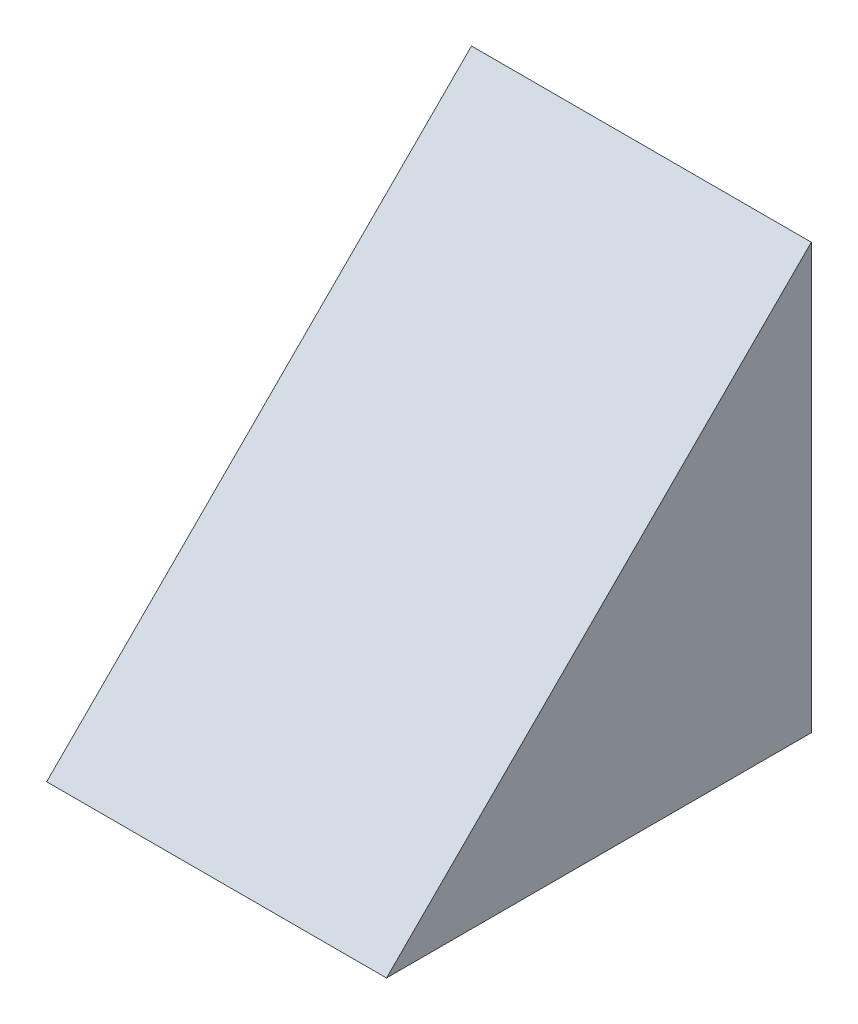
ISO-10303-21;
HEADER;
FILE_DESCRIPTION(('STEP AP214'),'2;1');
FILE_NAME('part.step','',(''),(''),'','','');
FILE_SCHEMA(('AUTOMOTIVE_DESIGN { 1 0 10303 214 1 1 1 1 }'));
ENDSEC;
DATA;
#1=APPLICATION_CONTEXT('core data for automotive mechanical design processes');
#2=APPLICATION_PROTOCOL_DEFINITION('international standard','automotive_design',2000,#1);
#3=PRODUCT_CONTEXT('',#1,'mechanical');
#4=PRODUCT('Part','Part','',(#3));
#5=PRODUCT_RELATED_PRODUCT_CATEGORY('part','',(#4));
#6=PRODUCT_DEFINITION_FORMATION('','',#4);
#7=PRODUCT_DEFINITION_CONTEXT('part definition',#1,'design');
#8=PRODUCT_DEFINITION('design','',#6,#7);
#9=PRODUCT_DEFINITION_SHAPE('','',#8);
#10=(LENGTH_UNIT() NAMED_UNIT(*) SI_UNIT(.MILLI.,.METRE.));
#11=(NAMED_UNIT(*) PLANE_ANGLE_UNIT() SI_UNIT($,.RADIAN.));
#12=(NAMED_UNIT(*) SI_UNIT($,.STERADIAN.) SOLID_ANGLE_UNIT());
#13=UNCERTAINTY_MEASURE_WITH_UNIT(LENGTH_MEASURE(1.E-05),#10,'distance_accuracy_value','');
#14=(GEOMETRIC_REPRESENTATION_CONTEXT(3) GLOBAL_UNCERTAINTY_ASSIGNED_CONTEXT((#13)) GLOBAL_UNIT_ASSIGNED_CONTEXT((#10,
#11,#12)) REPRESENTATION_CONTEXT('',''));
#15=CARTESIAN_POINT('',(0.,0.,0.));
#16=DIRECTION('',(0.,0.,1.));
#17=DIRECTION('',(1.,0.,0.));
#18=AXIS2_PLACEMENT_3D('',#15,#16,#17);
#19=CARTESIAN_POINT('',(20.,25.,-12.5));
#20=DIRECTION('',(0.,-0.707106781186548,-0.707106781186548));
#21=DIRECTION('',(0.,0.707106781186548,-0.707106781186548));
#22=AXIS2_PLACEMENT_3D('',#19,#20,#21);
#23=PLANE('',#22);
#24=DIRECTION('',(0.,-0.707106781186547,0.707106781186547));
#25=VECTOR('',#24,1.);
#26=CARTESIAN_POINT('',(0.,25.,-12.5));
#27=LINE('',#26,#25);
#28=CARTESIAN_POINT('',(0.,25.,-12.5));
#29=VERTEX_POINT('',#28);
#30=CARTESIAN_POINT('',(0.,0.,12.5));
#31=VERTEX_POINT('',#30);
#32=EDGE_CURVE('E95',#29,#31,#27,.T.);
#33=ORIENTED_EDGE('',*,*,#32,.T.);
#34=DIRECTION('',(-1.,0.,0.));
#35=VECTOR('',#34,1.);
#36=CARTESIAN_POINT('',(20.,0.,12.5));
#37=LINE('',#36,#35);
#38=CARTESIAN_POINT('',(20.,0.,12.5));
#39=VERTEX_POINT('',#38);
#40=EDGE_CURVE('E11',#39,#31,#37,.T.);
#41=ORIENTED_EDGE('',*,*,#40,.F.);
#42=DIRECTION('',(0.,-0.707106781186547,0.707106781186547));
#43=VECTOR('',#42,1.);
#44=CARTESIAN_POINT('',(20.,25.,-12.5));
#45=LINE('',#44,#43);
#46=CARTESIAN_POINT('',(20.,25.,-12.5));
#47=VERTEX_POINT('',#46);
#48=EDGE_CURVE('E87',#47,#39,#45,.T.);
#49=ORIENTED_EDGE('',*,*,#48,.F.);
#50=DIRECTION('',(-1.,0.,0.));
#51=VECTOR('',#50,1.);
#52=CARTESIAN_POINT('',(20.,25.,-12.5));
#53=LINE('',#52,#51);
#54=EDGE_CURVE('E96',#47,#29,#53,.T.);
#55=ORIENTED_EDGE('',*,*,#54,.T.);
#56=EDGE_LOOP('',(#33,#41,#49,#55));
#57=FACE_BOUND('',#56,.T.);
#58=ADVANCED_FACE('F45',(#57),#23,.F.);
#59=CARTESIAN_POINT('',(20.,0.,12.5));
#60=DIRECTION('',(0.,1.,0.));
#61=DIRECTION('',(0.,0.,1.));
#62=AXIS2_PLACEMENT_3D('',#59,#60,#61);
#63=PLANE('',#62);
#64=CARTESIAN_POINT('',(10.,0.,-2.5));
#65=DIRECTION('',(0.,-1.,0.));
#66=DIRECTION('',(0.,0.,-1.));
#67=AXIS2_PLACEMENT_3D('',#64,#65,#66);
#68=CIRCLE('',#67,2.);
#69=CARTESIAN_POINT('',(10.,0.,-4.5));
#70=VERTEX_POINT('',#69);
#71=EDGE_CURVE('E140',#70,#70,#68,.T.);
#72=ORIENTED_EDGE('',*,*,#71,.F.);
#73=EDGE_LOOP('',(#72));
#74=FACE_BOUND('',#73,.T.);
#75=DIRECTION('',(0.,0.,-1.));
#76=VECTOR('',#75,1.);
#77=CARTESIAN_POINT('',(0.,0.,12.5));
#78=LINE('',#77,#76);
#79=CARTESIAN_POINT('',(0.,0.,-12.5));
#80=VERTEX_POINT('',#79);
#81=EDGE_CURVE('E74',#31,#80,#78,.T.);
#82=ORIENTED_EDGE('',*,*,#81,.T.);
#83=DIRECTION('',(-1.,0.,0.));
#84=VECTOR('',#83,1.);
#85=CARTESIAN_POINT('',(20.,0.,-12.5));
#86=LINE('',#85,#84);
#87=CARTESIAN_POINT('',(20.,0.,-12.5));
#88=VERTEX_POINT('',#87);
#89=EDGE_CURVE('E54',#88,#80,#86,.T.);
#90=ORIENTED_EDGE('',*,*,#89,.F.);
#91=DIRECTION('',(0.,0.,-1.));
#92=VECTOR('',#91,1.);
#93=CARTESIAN_POINT('',(20.,0.,12.5));
#94=LINE('',#93,#92);
#95=EDGE_CURVE('E82',#39,#88,#94,.T.);
#96=ORIENTED_EDGE('',*,*,#95,.F.);
#97=ORIENTED_EDGE('',*,*,#40,.T.);
#98=EDGE_LOOP('',(#82,#90,#96,#97));
#99=FACE_BOUND('',#98,.T.);
#100=ADVANCED_FACE('F83',(#74,#99),#63,.F.);
#101=CARTESIAN_POINT('',(20.,0.,-12.5));
#102=DIRECTION('',(0.,0.,1.));
#103=DIRECTION('',(1.,0.,0.));
#104=AXIS2_PLACEMENT_3D('',#101,#102,#103);
#105=PLANE('',#104);
#106=CARTESIAN_POINT('',(10.,10.,-12.5));
#107=DIRECTION('',(0.,0.,-1.));
#108=DIRECTION('',(-1.,0.,0.));
#109=AXIS2_PLACEMENT_3D('',#106,#107,#108);
#110=CIRCLE('',#109,2.);
#111=CARTESIAN_POINT('',(8.,10.,-12.5));
#112=VERTEX_POINT('',#111);
#113=EDGE_CURVE('E105',#112,#112,#110,.T.);
#114=ORIENTED_EDGE('',*,*,#113,.F.);
#115=EDGE_LOOP('',(#114));
#116=FACE_BOUND('',#115,.T.);
#117=DIRECTION('',(0.,1.,0.));
#118=VECTOR('',#117,1.);
#119=CARTESIAN_POINT('',(0.,0.,-12.5));
#120=LINE('',#119,#118);
#121=EDGE_CURVE('E79',#80,#29,#120,.T.);
#122=ORIENTED_EDGE('',*,*,#121,.T.);
#123=ORIENTED_EDGE('',*,*,#54,.F.);
#124=DIRECTION('',(0.,1.,0.));
#125=VECTOR('',#124,1.);
#126=CARTESIAN_POINT('',(20.,0.,-12.5));
#127=LINE('',#126,#125);
#128=EDGE_CURVE('E62',#88,#47,#127,.T.);
#129=ORIENTED_EDGE('',*,*,#128,.F.);
#130=ORIENTED_EDGE('',*,*,#89,.T.);
#131=EDGE_LOOP('',(#122,#123,#129,#130));
#132=FACE_BOUND('',#131,.T.);
#133=ADVANCED_FACE('F113',(#116,#132),#105,.F.);
#134=CARTESIAN_POINT('',(20.,0.,0.));
#135=DIRECTION('',(1.,0.,0.));
#136=DIRECTION('',(0.,0.,-1.));
#137=AXIS2_PLACEMENT_3D('',#134,#135,#136);
#138=PLANE('',#137);
#139=ORIENTED_EDGE('',*,*,#48,.T.);
#140=ORIENTED_EDGE('',*,*,#95,.T.);
#141=ORIENTED_EDGE('',*,*,#128,.T.);
#142=EDGE_LOOP('',(#139,#140,#141));
#143=FACE_BOUND('',#142,.T.);
#144=ADVANCED_FACE('F90',(#143),#138,.T.);
#145=CARTESIAN_POINT('',(0.,0.,0.));
#146=DIRECTION('',(1.,0.,0.));
#147=DIRECTION('',(0.,0.,-1.));
#148=AXIS2_PLACEMENT_3D('',#145,#146,#147);
#149=PLANE('',#148);
#150=ORIENTED_EDGE('',*,*,#32,.F.);
#151=ORIENTED_EDGE('',*,*,#121,.F.);
#152=ORIENTED_EDGE('',*,*,#81,.F.);
#153=EDGE_LOOP('',(#150,#151,#152));
#154=FACE_BOUND('',#153,.T.);
#155=ADVANCED_FACE('F114',(#154),#149,.F.);
#156=CARTESIAN_POINT('',(10.,10.,-6.5));
#157=DIRECTION('',(0.,0.,-1.));
#158=DIRECTION('',(-1.,0.,0.));
#159=AXIS2_PLACEMENT_3D('',#156,#157,#158);
#160=CYLINDRICAL_SURFACE('',#159,2.);
#161=CARTESIAN_POINT('',(10.,10.,-6.5));
#162=DIRECTION('',(0.,0.,-1.));
#163=DIRECTION('',(-1.,0.,0.));
#164=AXIS2_PLACEMENT_3D('',#161,#162,#163);
#165=CIRCLE('',#164,2.);
#166=CARTESIAN_POINT('',(8.,10.,-6.5));
#167=VERTEX_POINT('',#166);
#168=EDGE_CURVE('E99',#167,#167,#165,.T.);
#169=ORIENTED_EDGE('',*,*,#168,.F.);
#170=EDGE_LOOP('',(#169));
#171=FACE_BOUND('',#170,.T.);
#172=ORIENTED_EDGE('',*,*,#113,.T.);
#173=EDGE_LOOP('',(#172));
#174=FACE_BOUND('',#173,.T.);
#175=ADVANCED_FACE('F116',(#171,#174),#160,.F.);
#176=CARTESIAN_POINT('',(10.,10.,-6.5));
#177=DIRECTION('',(0.,0.,-1.));
#178=DIRECTION('',(-1.,0.,0.));
#179=AXIS2_PLACEMENT_3D('',#176,#177,#178);
#180=PLANE('',#179);
#181=ORIENTED_EDGE('',*,*,#168,.T.);
#182=EDGE_LOOP('',(#181));
#183=FACE_BOUND('',#182,.T.);
#184=ADVANCED_FACE('F123',(#183),#180,.T.);
#185=CARTESIAN_POINT('',(10.,6.,-2.5));
#186=DIRECTION('',(0.,-1.,0.));
#187=DIRECTION('',(0.,0.,-1.));
#188=AXIS2_PLACEMENT_3D('',#185,#186,#187);
#189=CYLINDRICAL_SURFACE('',#188,2.);
#190=CARTESIAN_POINT('',(10.,6.,-2.5));
#191=DIRECTION('',(0.,-1.,0.));
#192=DIRECTION('',(0.,0.,-1.));
#193=AXIS2_PLACEMENT_3D('',#190,#191,#192);
#194=CIRCLE('',#193,2.);
#195=CARTESIAN_POINT('',(10.,6.,-4.5));
#196=VERTEX_POINT('',#195);
#197=EDGE_CURVE('E143',#196,#196,#194,.T.);
#198=ORIENTED_EDGE('',*,*,#197,.F.);
#199=EDGE_LOOP('',(#198));
#200=FACE_BOUND('',#199,.T.);
#201=ORIENTED_EDGE('',*,*,#71,.T.);
#202=EDGE_LOOP('',(#201));
#203=FACE_BOUND('',#202,.T.);
#204=ADVANCED_FACE('F157',(#200,#203),#189,.F.);
#205=CARTESIAN_POINT('',(10.,6.,-2.5));
#206=DIRECTION('',(0.,-1.,0.));
#207=DIRECTION('',(0.,0.,-1.));
#208=AXIS2_PLACEMENT_3D('',#205,#206,#207);
#209=PLANE('',#208);
#210=ORIENTED_EDGE('',*,*,#197,.T.);
#211=EDGE_LOOP('',(#210));
#212=FACE_BOUND('',#211,.T.);
#213=ADVANCED_FACE('F155',(#212),#209,.T.);
#214=CLOSED_SHELL('',(#58,#100,#133,#144,#155,#175,#184,#204,#213));
#215=MANIFOLD_SOLID_BREP('B2',#214);
#216=ADVANCED_BREP_SHAPE_REPRESENTATION('',(#18,#215),#14);
#217=SHAPE_DEFINITION_REPRESENTATION(#9,#216);
ENDSEC;
END-ISO-10303-21;
